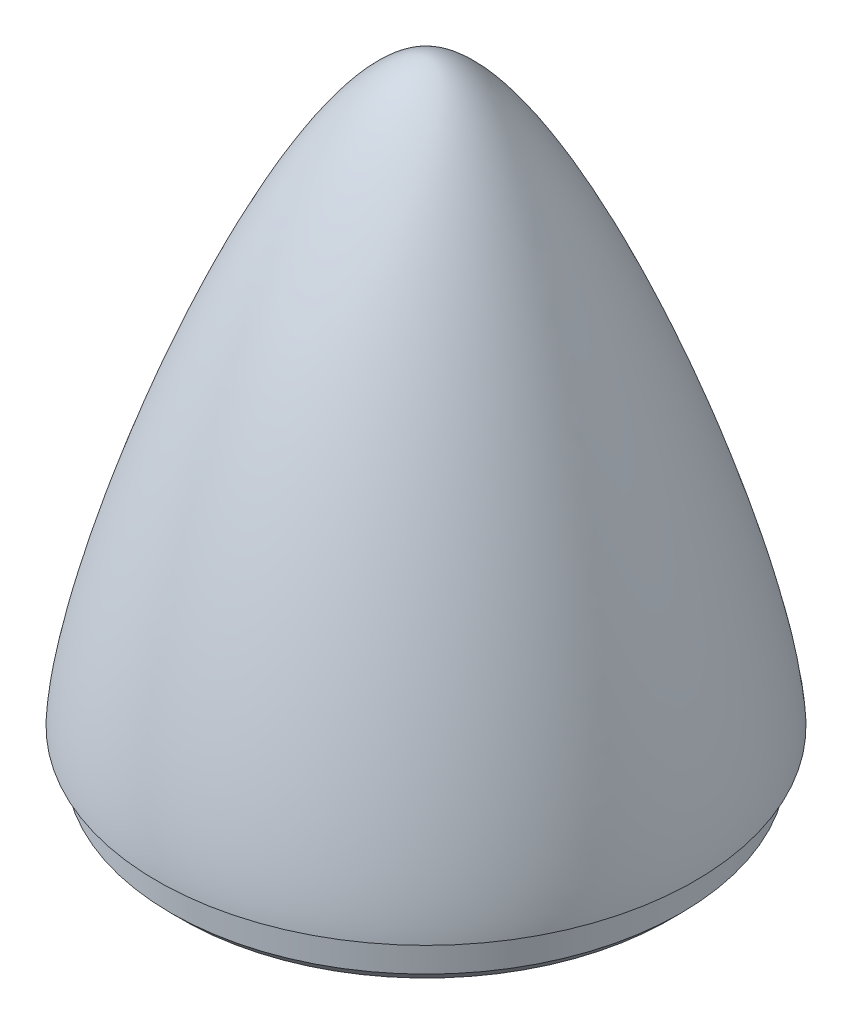
ISO-10303-21;
HEADER;
FILE_DESCRIPTION(('STEP AP214'),'2;1');
FILE_NAME('part.step','',(''),(''),'','','');
FILE_SCHEMA(('AUTOMOTIVE_DESIGN { 1 0 10303 214 1 1 1 1 }'));
ENDSEC;
DATA;
#1=APPLICATION_CONTEXT('core data for automotive mechanical design processes');
#2=APPLICATION_PROTOCOL_DEFINITION('international standard','automotive_design',2000,#1);
#3=PRODUCT_CONTEXT('',#1,'mechanical');
#4=PRODUCT('Part','Part','',(#3));
#5=PRODUCT_RELATED_PRODUCT_CATEGORY('part','',(#4));
#6=PRODUCT_DEFINITION_FORMATION('','',#4);
#7=PRODUCT_DEFINITION_CONTEXT('part definition',#1,'design');
#8=PRODUCT_DEFINITION('design','',#6,#7);
#9=PRODUCT_DEFINITION_SHAPE('','',#8);
#10=(LENGTH_UNIT() NAMED_UNIT(*) SI_UNIT(.MILLI.,.METRE.));
#11=(NAMED_UNIT(*) PLANE_ANGLE_UNIT() SI_UNIT($,.RADIAN.));
#12=(NAMED_UNIT(*) SI_UNIT($,.STERADIAN.) SOLID_ANGLE_UNIT());
#13=UNCERTAINTY_MEASURE_WITH_UNIT(LENGTH_MEASURE(1.E-05),#10,'distance_accuracy_value','');
#14=(GEOMETRIC_REPRESENTATION_CONTEXT(3) GLOBAL_UNCERTAINTY_ASSIGNED_CONTEXT((#13)) GLOBAL_UNIT_ASSIGNED_CONTEXT((#10,
#11,#12)) REPRESENTATION_CONTEXT('',''));
#15=CARTESIAN_POINT('',(0.,0.,0.));
#16=DIRECTION('',(0.,0.,1.));
#17=DIRECTION('',(1.,0.,0.));
#18=AXIS2_PLACEMENT_3D('',#15,#16,#17);
#19=CARTESIAN_POINT('',(0.,172.282146570095,0.));
#20=CARTESIAN_POINT('',(-8.91369854593734,172.11452311016,0.));
#21=CARTESIAN_POINT('',(-22.6743928931859,133.228168876473,0.));
#22=CARTESIAN_POINT('',(-23.2,122.282146570095,0.));
#23=B_SPLINE_CURVE_WITH_KNOTS('',3,(#19,#20,#21,#22),.UNSPECIFIED.,.F.,.F.,(4,4),(0.,1.),.UNSPECIFIED.);
#24=CARTESIAN_POINT('',(0.,122.282146570095,0.));
#25=DIRECTION('',(0.,-1.,0.));
#26=AXIS1_PLACEMENT('',#24,#25);
#27=SURFACE_OF_REVOLUTION('',#23,#26);
#28=CARTESIAN_POINT('',(0.,122.282146570095,0.));
#29=DIRECTION('',(0.,-1.,0.));
#30=DIRECTION('',(0.,0.,-1.));
#31=AXIS2_PLACEMENT_3D('',#28,#29,#30);
#32=CIRCLE('',#31,23.2);
#33=CARTESIAN_POINT('',(0.,122.282146570095,-23.2));
#34=VERTEX_POINT('',#33);
#35=EDGE_CURVE('E11',#34,#34,#32,.T.);
#36=ORIENTED_EDGE('',*,*,#35,.F.);
#37=EDGE_LOOP('',(#36));
#38=FACE_BOUND('',#37,.T.);
#39=CARTESIAN_POINT('',(0.,172.282146570095,0.));
#40=VERTEX_POINT('',#39);
#41=VERTEX_LOOP('',#40);
#42=FACE_BOUND('',#41,.T.);
#43=ADVANCED_FACE('F35',(#38,#42),#27,.T.);
#44=CARTESIAN_POINT('',(-22.,122.282146570095,0.));
#45=DIRECTION('',(0.,1.,0.));
#46=DIRECTION('',(0.,0.,1.));
#47=AXIS2_PLACEMENT_3D('',#44,#45,#46);
#48=PLANE('',#47);
#49=CARTESIAN_POINT('',(0.,122.282146570095,0.));
#50=DIRECTION('',(0.,-1.,0.));
#51=DIRECTION('',(0.,0.,-1.));
#52=AXIS2_PLACEMENT_3D('',#49,#50,#51);
#53=CIRCLE('',#52,22.);
#54=CARTESIAN_POINT('',(0.,122.282146570095,-22.));
#55=VERTEX_POINT('',#54);
#56=EDGE_CURVE('E42',#55,#55,#53,.T.);
#57=ORIENTED_EDGE('',*,*,#56,.F.);
#58=EDGE_LOOP('',(#57));
#59=FACE_BOUND('',#58,.T.);
#60=ORIENTED_EDGE('',*,*,#35,.T.);
#61=EDGE_LOOP('',(#60));
#62=FACE_BOUND('',#61,.T.);
#63=ADVANCED_FACE('F46',(#59,#62),#48,.F.);
#64=CARTESIAN_POINT('',(0.,122.282146570095,0.));
#65=DIRECTION('',(0.,-1.,0.));
#66=DIRECTION('',(0.,0.,-1.));
#67=AXIS2_PLACEMENT_3D('',#64,#65,#66);
#68=CYLINDRICAL_SURFACE('',#67,22.);
#69=CARTESIAN_POINT('',(0.,119.282146570095,0.));
#70=DIRECTION('',(0.,-1.,0.));
#71=DIRECTION('',(0.,0.,-1.));
#72=AXIS2_PLACEMENT_3D('',#69,#70,#71);
#73=CIRCLE('',#72,22.);
#74=CARTESIAN_POINT('',(0.,119.282146570095,-22.));
#75=VERTEX_POINT('',#74);
#76=EDGE_CURVE('E74',#75,#75,#73,.T.);
#77=ORIENTED_EDGE('',*,*,#76,.F.);
#78=EDGE_LOOP('',(#77));
#79=FACE_BOUND('',#78,.T.);
#80=ORIENTED_EDGE('',*,*,#56,.T.);
#81=EDGE_LOOP('',(#80));
#82=FACE_BOUND('',#81,.T.);
#83=ADVANCED_FACE('F51',(#79,#82),#68,.T.);
#84=CARTESIAN_POINT('',(0.,119.282146570095,0.));
#85=DIRECTION('',(0.,1.,0.));
#86=DIRECTION('',(0.,0.,1.));
#87=AXIS2_PLACEMENT_3D('',#84,#85,#86);
#88=CONICAL_SURFACE('',#87,22.,0.785398163397448);
#89=CARTESIAN_POINT('',(0.,118.282146570095,0.));
#90=DIRECTION('',(0.,-1.,0.));
#91=DIRECTION('',(0.,0.,-1.));
#92=AXIS2_PLACEMENT_3D('',#89,#90,#91);
#93=CIRCLE('',#92,21.);
#94=CARTESIAN_POINT('',(0.,118.282146570095,-21.));
#95=VERTEX_POINT('',#94);
#96=EDGE_CURVE('E73',#95,#95,#93,.T.);
#97=ORIENTED_EDGE('',*,*,#96,.F.);
#98=EDGE_LOOP('',(#97));
#99=FACE_BOUND('',#98,.T.);
#100=ORIENTED_EDGE('',*,*,#76,.T.);
#101=EDGE_LOOP('',(#100));
#102=FACE_BOUND('',#101,.T.);
#103=ADVANCED_FACE('F58',(#99,#102),#88,.T.);
#104=CARTESIAN_POINT('',(0.,118.282146570095,0.));
#105=DIRECTION('',(0.,1.,0.));
#106=DIRECTION('',(0.,0.,1.));
#107=AXIS2_PLACEMENT_3D('',#104,#105,#106);
#108=PLANE('',#107);
#109=ORIENTED_EDGE('',*,*,#96,.T.);
#110=EDGE_LOOP('',(#109));
#111=FACE_BOUND('',#110,.T.);
#112=ADVANCED_FACE('F65',(#111),#108,.F.);
#113=CLOSED_SHELL('',(#43,#63,#83,#103,#112));
#114=MANIFOLD_SOLID_BREP('B2',#113);
#115=ADVANCED_BREP_SHAPE_REPRESENTATION('',(#18,#114),#14);
#116=SHAPE_DEFINITION_REPRESENTATION(#9,#115);
ENDSEC;
END-ISO-10303-21;
